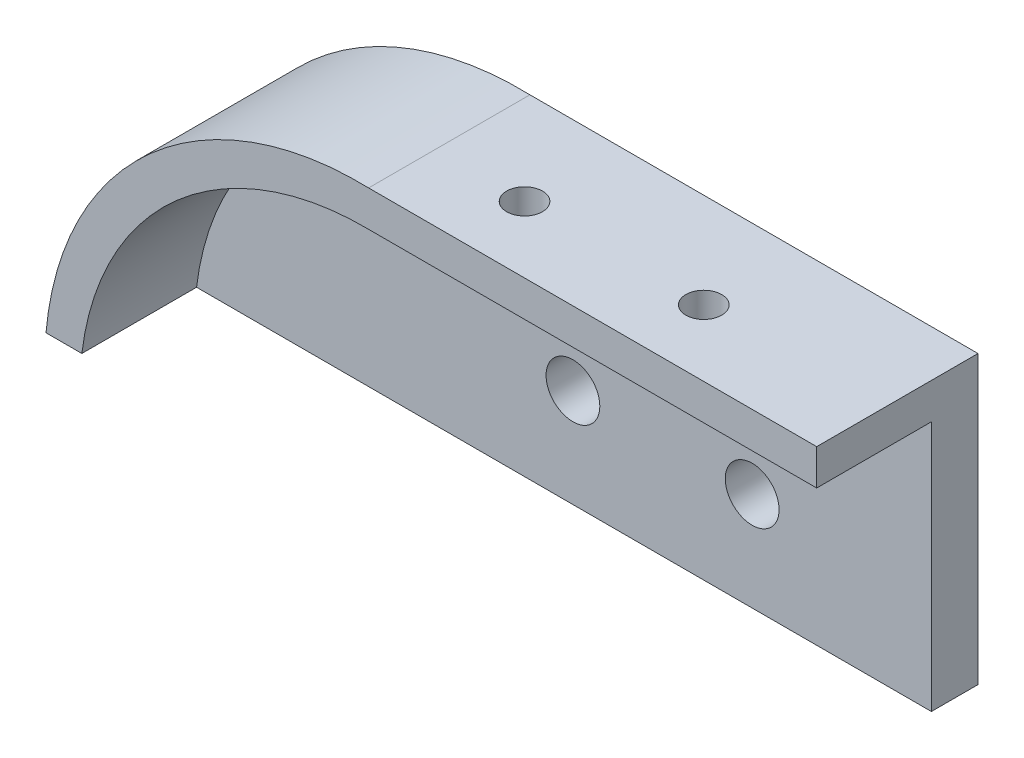
ISO-10303-21;
HEADER;
FILE_DESCRIPTION(('STEP AP214'),'2;1');
FILE_NAME('part.step','',(''),(''),'','','');
FILE_SCHEMA(('AUTOMOTIVE_DESIGN { 1 0 10303 214 1 1 1 1 }'));
ENDSEC;
DATA;
#1=APPLICATION_CONTEXT('core data for automotive mechanical design processes');
#2=APPLICATION_PROTOCOL_DEFINITION('international standard','automotive_design',2000,#1);
#3=PRODUCT_CONTEXT('',#1,'mechanical');
#4=PRODUCT('Part','Part','',(#3));
#5=PRODUCT_RELATED_PRODUCT_CATEGORY('part','',(#4));
#6=PRODUCT_DEFINITION_FORMATION('','',#4);
#7=PRODUCT_DEFINITION_CONTEXT('part definition',#1,'design');
#8=PRODUCT_DEFINITION('design','',#6,#7);
#9=PRODUCT_DEFINITION_SHAPE('','',#8);
#10=(LENGTH_UNIT() NAMED_UNIT(*) SI_UNIT(.MILLI.,.METRE.));
#11=(NAMED_UNIT(*) PLANE_ANGLE_UNIT() SI_UNIT($,.RADIAN.));
#12=(NAMED_UNIT(*) SI_UNIT($,.STERADIAN.) SOLID_ANGLE_UNIT());
#13=UNCERTAINTY_MEASURE_WITH_UNIT(LENGTH_MEASURE(1.E-05),#10,'distance_accuracy_value','');
#14=(GEOMETRIC_REPRESENTATION_CONTEXT(3) GLOBAL_UNCERTAINTY_ASSIGNED_CONTEXT((#13)) GLOBAL_UNIT_ASSIGNED_CONTEXT((#10,
#11,#12)) REPRESENTATION_CONTEXT('',''));
#15=CARTESIAN_POINT('',(0.,0.,0.));
#16=DIRECTION('',(0.,0.,1.));
#17=DIRECTION('',(1.,0.,0.));
#18=AXIS2_PLACEMENT_3D('',#15,#16,#17);
#19=CARTESIAN_POINT('',(-0.257118747397676,-0.773241409177615,0.));
#20=DIRECTION('',(0.,0.,1.));
#21=DIRECTION('',(1.,0.,0.));
#22=AXIS2_PLACEMENT_3D('',#19,#20,#21);
#23=CYLINDRICAL_SURFACE('',#22,8.7770083100093);
#24=CARTESIAN_POINT('',(-0.257118747397676,-0.773241409177615,4.5));
#25=DIRECTION('',(0.,0.,1.));
#26=DIRECTION('',(1.,0.,0.));
#27=AXIS2_PLACEMENT_3D('',#24,#25,#26);
#28=CIRCLE('',#27,8.7770083100093);
#29=CARTESIAN_POINT('',(0.,8.,4.5));
#30=VERTEX_POINT('',#29);
#31=CARTESIAN_POINT('',(-9.,0.,4.5));
#32=VERTEX_POINT('',#31);
#33=EDGE_CURVE('E139',#30,#32,#28,.T.);
#34=ORIENTED_EDGE('',*,*,#33,.F.);
#35=DIRECTION('',(0.,0.,1.));
#36=VECTOR('',#35,1.);
#37=CARTESIAN_POINT('',(0.,8.,0.));
#38=LINE('',#37,#36);
#39=CARTESIAN_POINT('',(0.,8.,0.));
#40=VERTEX_POINT('',#39);
#41=EDGE_CURVE('E11',#40,#30,#38,.T.);
#42=ORIENTED_EDGE('',*,*,#41,.F.);
#43=CARTESIAN_POINT('',(-0.257118747397676,-0.773241409177615,0.));
#44=DIRECTION('',(0.,0.,1.));
#45=DIRECTION('',(1.,0.,0.));
#46=AXIS2_PLACEMENT_3D('',#43,#44,#45);
#47=CIRCLE('',#46,8.7770083100093);
#48=CARTESIAN_POINT('',(-9.,0.,0.));
#49=VERTEX_POINT('',#48);
#50=EDGE_CURVE('E129',#40,#49,#47,.T.);
#51=ORIENTED_EDGE('',*,*,#50,.T.);
#52=DIRECTION('',(0.,0.,1.));
#53=VECTOR('',#52,1.);
#54=CARTESIAN_POINT('',(-9.,0.,0.));
#55=LINE('',#54,#53);
#56=EDGE_CURVE('E81',#49,#32,#55,.T.);
#57=ORIENTED_EDGE('',*,*,#56,.T.);
#58=EDGE_LOOP('',(#34,#42,#51,#57));
#59=FACE_BOUND('',#58,.T.);
#60=ADVANCED_FACE('F35',(#59),#23,.T.);
#61=CARTESIAN_POINT('',(12.5,8.,0.));
#62=DIRECTION('',(0.,1.,0.));
#63=DIRECTION('',(-1.,0.,0.));
#64=AXIS2_PLACEMENT_3D('',#61,#62,#63);
#65=PLANE('',#64);
#66=CARTESIAN_POINT('',(2.5,8.,2.65));
#67=DIRECTION('',(0.,1.,0.));
#68=DIRECTION('',(0.,0.,1.));
#69=AXIS2_PLACEMENT_3D('',#66,#67,#68);
#70=CIRCLE('',#69,0.499999999999988);
#71=CARTESIAN_POINT('',(2.5,8.,3.14999999999999));
#72=VERTEX_POINT('',#71);
#73=EDGE_CURVE('E163',#72,#72,#70,.T.);
#74=ORIENTED_EDGE('',*,*,#73,.F.);
#75=EDGE_LOOP('',(#74));
#76=FACE_BOUND('',#75,.T.);
#77=CARTESIAN_POINT('',(7.5,8.,2.65));
#78=DIRECTION('',(0.,1.,0.));
#79=DIRECTION('',(0.,0.,1.));
#80=AXIS2_PLACEMENT_3D('',#77,#78,#79);
#81=CIRCLE('',#80,0.499999999999988);
#82=CARTESIAN_POINT('',(7.5,8.,3.14999999999999));
#83=VERTEX_POINT('',#82);
#84=EDGE_CURVE('E154',#83,#83,#81,.T.);
#85=ORIENTED_EDGE('',*,*,#84,.F.);
#86=EDGE_LOOP('',(#85));
#87=FACE_BOUND('',#86,.T.);
#88=DIRECTION('',(-1.,0.,0.));
#89=VECTOR('',#88,1.);
#90=CARTESIAN_POINT('',(12.5,8.,4.5));
#91=LINE('',#90,#89);
#92=CARTESIAN_POINT('',(12.5,8.,4.5));
#93=VERTEX_POINT('',#92);
#94=EDGE_CURVE('E132',#93,#30,#91,.T.);
#95=ORIENTED_EDGE('',*,*,#94,.F.);
#96=DIRECTION('',(0.,0.,1.));
#97=VECTOR('',#96,1.);
#98=CARTESIAN_POINT('',(12.5,8.,0.));
#99=LINE('',#98,#97);
#100=CARTESIAN_POINT('',(12.5,8.,0.));
#101=VERTEX_POINT('',#100);
#102=EDGE_CURVE('E43',#101,#93,#99,.T.);
#103=ORIENTED_EDGE('',*,*,#102,.F.);
#104=DIRECTION('',(-1.,0.,0.));
#105=VECTOR('',#104,1.);
#106=CARTESIAN_POINT('',(12.5,8.,0.));
#107=LINE('',#106,#105);
#108=EDGE_CURVE('E137',#101,#40,#107,.T.);
#109=ORIENTED_EDGE('',*,*,#108,.T.);
#110=ORIENTED_EDGE('',*,*,#41,.T.);
#111=EDGE_LOOP('',(#95,#103,#109,#110));
#112=FACE_BOUND('',#111,.T.);
#113=ADVANCED_FACE('F178',(#76,#87,#112),#65,.T.);
#114=CARTESIAN_POINT('',(12.5,0.,0.));
#115=DIRECTION('',(1.,0.,0.));
#116=DIRECTION('',(0.,0.,-1.));
#117=AXIS2_PLACEMENT_3D('',#114,#115,#116);
#118=PLANE('',#117);
#119=DIRECTION('',(0.,0.,1.));
#120=VECTOR('',#119,1.);
#121=CARTESIAN_POINT('',(12.5,7.,1.3));
#122=LINE('',#121,#120);
#123=CARTESIAN_POINT('',(12.5,7.,1.3));
#124=VERTEX_POINT('',#123);
#125=CARTESIAN_POINT('',(12.5,7.,4.5));
#126=VERTEX_POINT('',#125);
#127=EDGE_CURVE('E51',#124,#126,#122,.T.);
#128=ORIENTED_EDGE('',*,*,#127,.F.);
#129=DIRECTION('',(0.,1.,0.));
#130=VECTOR('',#129,1.);
#131=CARTESIAN_POINT('',(12.5,0.,1.3));
#132=LINE('',#131,#130);
#133=CARTESIAN_POINT('',(12.5,0.,1.3));
#134=VERTEX_POINT('',#133);
#135=EDGE_CURVE('E109',#134,#124,#132,.T.);
#136=ORIENTED_EDGE('',*,*,#135,.F.);
#137=DIRECTION('',(0.,0.,1.));
#138=VECTOR('',#137,1.);
#139=CARTESIAN_POINT('',(12.5,0.,0.));
#140=LINE('',#139,#138);
#141=CARTESIAN_POINT('',(12.5,0.,0.));
#142=VERTEX_POINT('',#141);
#143=EDGE_CURVE('E149',#142,#134,#140,.T.);
#144=ORIENTED_EDGE('',*,*,#143,.F.);
#145=DIRECTION('',(0.,1.,0.));
#146=VECTOR('',#145,1.);
#147=CARTESIAN_POINT('',(12.5,0.,0.));
#148=LINE('',#147,#146);
#149=EDGE_CURVE('E134',#142,#101,#148,.T.);
#150=ORIENTED_EDGE('',*,*,#149,.T.);
#151=ORIENTED_EDGE('',*,*,#102,.T.);
#152=DIRECTION('',(0.,1.,0.));
#153=VECTOR('',#152,1.);
#154=CARTESIAN_POINT('',(12.5,0.,4.5));
#155=LINE('',#154,#153);
#156=EDGE_CURVE('E122',#126,#93,#155,.T.);
#157=ORIENTED_EDGE('',*,*,#156,.F.);
#158=EDGE_LOOP('',(#128,#136,#144,#150,#151,#157));
#159=FACE_BOUND('',#158,.T.);
#160=ADVANCED_FACE('F120',(#159),#118,.T.);
#161=CARTESIAN_POINT('',(-9.,0.,0.));
#162=DIRECTION('',(0.,-1.,0.));
#163=DIRECTION('',(0.,0.,-1.));
#164=AXIS2_PLACEMENT_3D('',#161,#162,#163);
#165=PLANE('',#164);
#166=DIRECTION('',(0.,0.,1.));
#167=VECTOR('',#166,1.);
#168=CARTESIAN_POINT('',(-8.,0.,1.3));
#169=LINE('',#168,#167);
#170=CARTESIAN_POINT('',(-8.,0.,1.3));
#171=VERTEX_POINT('',#170);
#172=CARTESIAN_POINT('',(-8.,0.,4.5));
#173=VERTEX_POINT('',#172);
#174=EDGE_CURVE('E124',#171,#173,#169,.T.);
#175=ORIENTED_EDGE('',*,*,#174,.T.);
#176=DIRECTION('',(1.,0.,0.));
#177=VECTOR('',#176,1.);
#178=CARTESIAN_POINT('',(-9.,0.,4.5));
#179=LINE('',#178,#177);
#180=EDGE_CURVE('E142',#32,#173,#179,.T.);
#181=ORIENTED_EDGE('',*,*,#180,.F.);
#182=ORIENTED_EDGE('',*,*,#56,.F.);
#183=DIRECTION('',(1.,0.,0.));
#184=VECTOR('',#183,1.);
#185=CARTESIAN_POINT('',(-9.,0.,0.));
#186=LINE('',#185,#184);
#187=EDGE_CURVE('E131',#49,#142,#186,.T.);
#188=ORIENTED_EDGE('',*,*,#187,.T.);
#189=ORIENTED_EDGE('',*,*,#143,.T.);
#190=DIRECTION('',(1.,0.,0.));
#191=VECTOR('',#190,1.);
#192=CARTESIAN_POINT('',(-8.,0.,1.3));
#193=LINE('',#192,#191);
#194=EDGE_CURVE('E114',#171,#134,#193,.T.);
#195=ORIENTED_EDGE('',*,*,#194,.F.);
#196=EDGE_LOOP('',(#175,#181,#182,#188,#189,#195));
#197=FACE_BOUND('',#196,.T.);
#198=ADVANCED_FACE('F169',(#197),#165,.T.);
#199=CARTESIAN_POINT('',(-0.257118747397676,-0.773241409177615,0.));
#200=DIRECTION('',(0.,0.,1.));
#201=DIRECTION('',(1.,0.,0.));
#202=AXIS2_PLACEMENT_3D('',#199,#200,#201);
#203=PLANE('',#202);
#204=CARTESIAN_POINT('',(7.5,2.75,0.));
#205=DIRECTION('',(0.,0.,1.));
#206=DIRECTION('',(1.,0.,0.));
#207=AXIS2_PLACEMENT_3D('',#204,#205,#206);
#208=CIRCLE('',#207,0.749999999999987);
#209=CARTESIAN_POINT('',(8.24999999999999,2.75,0.));
#210=VERTEX_POINT('',#209);
#211=EDGE_CURVE('E229',#210,#210,#208,.T.);
#212=ORIENTED_EDGE('',*,*,#211,.T.);
#213=EDGE_LOOP('',(#212));
#214=FACE_BOUND('',#213,.T.);
#215=CARTESIAN_POINT('',(2.5,2.75,0.));
#216=DIRECTION('',(0.,0.,1.));
#217=DIRECTION('',(1.,0.,0.));
#218=AXIS2_PLACEMENT_3D('',#215,#216,#217);
#219=CIRCLE('',#218,0.749999999999987);
#220=CARTESIAN_POINT('',(3.24999999999999,2.75,0.));
#221=VERTEX_POINT('',#220);
#222=EDGE_CURVE('E238',#221,#221,#219,.T.);
#223=ORIENTED_EDGE('',*,*,#222,.T.);
#224=EDGE_LOOP('',(#223));
#225=FACE_BOUND('',#224,.T.);
#226=ORIENTED_EDGE('',*,*,#50,.F.);
#227=ORIENTED_EDGE('',*,*,#108,.F.);
#228=ORIENTED_EDGE('',*,*,#149,.F.);
#229=ORIENTED_EDGE('',*,*,#187,.F.);
#230=EDGE_LOOP('',(#226,#227,#228,#229));
#231=FACE_BOUND('',#230,.T.);
#232=ADVANCED_FACE('F176',(#214,#225,#231),#203,.F.);
#233=CARTESIAN_POINT('',(-0.257118747397676,-0.773241409177615,4.5));
#234=DIRECTION('',(0.,0.,1.));
#235=DIRECTION('',(1.,0.,0.));
#236=AXIS2_PLACEMENT_3D('',#233,#234,#235);
#237=PLANE('',#236);
#238=CARTESIAN_POINT('',(-0.103321760120071,-0.953346559862777,4.5));
#239=DIRECTION('',(0.,0.,1.));
#240=DIRECTION('',(1.,0.,0.));
#241=AXIS2_PLACEMENT_3D('',#238,#239,#240);
#242=CIRCLE('',#241,7.95401765697031);
#243=CARTESIAN_POINT('',(0.,7.,4.5));
#244=VERTEX_POINT('',#243);
#245=EDGE_CURVE('E117',#244,#173,#242,.T.);
#246=ORIENTED_EDGE('',*,*,#245,.F.);
#247=DIRECTION('',(-1.,0.,0.));
#248=VECTOR('',#247,1.);
#249=CARTESIAN_POINT('',(12.5,7.,4.5));
#250=LINE('',#249,#248);
#251=EDGE_CURVE('E153',#126,#244,#250,.T.);
#252=ORIENTED_EDGE('',*,*,#251,.F.);
#253=ORIENTED_EDGE('',*,*,#156,.T.);
#254=ORIENTED_EDGE('',*,*,#94,.T.);
#255=ORIENTED_EDGE('',*,*,#33,.T.);
#256=ORIENTED_EDGE('',*,*,#180,.T.);
#257=EDGE_LOOP('',(#246,#252,#253,#254,#255,#256));
#258=FACE_BOUND('',#257,.T.);
#259=ADVANCED_FACE('F173',(#258),#237,.T.);
#260=CARTESIAN_POINT('',(-0.103321760120071,-0.953346559862777,1.3));
#261=DIRECTION('',(0.,0.,1.));
#262=DIRECTION('',(1.,0.,0.));
#263=AXIS2_PLACEMENT_3D('',#260,#261,#262);
#264=CYLINDRICAL_SURFACE('',#263,7.95401765697031);
#265=ORIENTED_EDGE('',*,*,#245,.T.);
#266=ORIENTED_EDGE('',*,*,#174,.F.);
#267=CARTESIAN_POINT('',(-0.103321760120071,-0.953346559862777,1.3));
#268=DIRECTION('',(0.,0.,1.));
#269=DIRECTION('',(1.,0.,0.));
#270=AXIS2_PLACEMENT_3D('',#267,#268,#269);
#271=CIRCLE('',#270,7.95401765697031);
#272=CARTESIAN_POINT('',(0.,7.,1.3));
#273=VERTEX_POINT('',#272);
#274=EDGE_CURVE('E108',#273,#171,#271,.T.);
#275=ORIENTED_EDGE('',*,*,#274,.F.);
#276=DIRECTION('',(0.,0.,1.));
#277=VECTOR('',#276,1.);
#278=CARTESIAN_POINT('',(0.,7.,1.3));
#279=LINE('',#278,#277);
#280=EDGE_CURVE('E104',#273,#244,#279,.T.);
#281=ORIENTED_EDGE('',*,*,#280,.T.);
#282=EDGE_LOOP('',(#265,#266,#275,#281));
#283=FACE_BOUND('',#282,.T.);
#284=ADVANCED_FACE('F199',(#283),#264,.F.);
#285=CARTESIAN_POINT('',(12.5,7.,1.3));
#286=DIRECTION('',(0.,1.,0.));
#287=DIRECTION('',(0.,0.,1.));
#288=AXIS2_PLACEMENT_3D('',#285,#286,#287);
#289=PLANE('',#288);
#290=CARTESIAN_POINT('',(2.5,7.,2.65));
#291=DIRECTION('',(0.,1.,0.));
#292=DIRECTION('',(0.,0.,1.));
#293=AXIS2_PLACEMENT_3D('',#290,#291,#292);
#294=CIRCLE('',#293,0.499999999999987);
#295=CARTESIAN_POINT('',(2.5,7.,3.14999999999999));
#296=VERTEX_POINT('',#295);
#297=EDGE_CURVE('E38',#296,#296,#294,.T.);
#298=ORIENTED_EDGE('',*,*,#297,.T.);
#299=EDGE_LOOP('',(#298));
#300=FACE_BOUND('',#299,.T.);
#301=CARTESIAN_POINT('',(7.5,7.,2.65));
#302=DIRECTION('',(0.,1.,0.));
#303=DIRECTION('',(0.,0.,1.));
#304=AXIS2_PLACEMENT_3D('',#301,#302,#303);
#305=CIRCLE('',#304,0.499999999999987);
#306=CARTESIAN_POINT('',(7.5,7.,3.14999999999999));
#307=VERTEX_POINT('',#306);
#308=EDGE_CURVE('E151',#307,#307,#305,.T.);
#309=ORIENTED_EDGE('',*,*,#308,.T.);
#310=EDGE_LOOP('',(#309));
#311=FACE_BOUND('',#310,.T.);
#312=ORIENTED_EDGE('',*,*,#251,.T.);
#313=ORIENTED_EDGE('',*,*,#280,.F.);
#314=DIRECTION('',(-1.,0.,0.));
#315=VECTOR('',#314,1.);
#316=CARTESIAN_POINT('',(12.5,7.,1.3));
#317=LINE('',#316,#315);
#318=EDGE_CURVE('E101',#124,#273,#317,.T.);
#319=ORIENTED_EDGE('',*,*,#318,.F.);
#320=ORIENTED_EDGE('',*,*,#127,.T.);
#321=EDGE_LOOP('',(#312,#313,#319,#320));
#322=FACE_BOUND('',#321,.T.);
#323=ADVANCED_FACE('F103',(#300,#311,#322),#289,.F.);
#324=CARTESIAN_POINT('',(-0.103321760120071,-0.953346559862777,1.3));
#325=DIRECTION('',(0.,0.,1.));
#326=DIRECTION('',(1.,0.,0.));
#327=AXIS2_PLACEMENT_3D('',#324,#325,#326);
#328=PLANE('',#327);
#329=CARTESIAN_POINT('',(7.5,2.75,1.3));
#330=DIRECTION('',(0.,0.,1.));
#331=DIRECTION('',(1.,0.,0.));
#332=AXIS2_PLACEMENT_3D('',#329,#330,#331);
#333=CIRCLE('',#332,0.749999999999987);
#334=CARTESIAN_POINT('',(8.24999999999999,2.75,1.3));
#335=VERTEX_POINT('',#334);
#336=EDGE_CURVE('E232',#335,#335,#333,.T.);
#337=ORIENTED_EDGE('',*,*,#336,.F.);
#338=EDGE_LOOP('',(#337));
#339=FACE_BOUND('',#338,.T.);
#340=CARTESIAN_POINT('',(2.5,2.75,1.3));
#341=DIRECTION('',(0.,0.,1.));
#342=DIRECTION('',(1.,0.,0.));
#343=AXIS2_PLACEMENT_3D('',#340,#341,#342);
#344=CIRCLE('',#343,0.749999999999987);
#345=CARTESIAN_POINT('',(3.24999999999999,2.75,1.3));
#346=VERTEX_POINT('',#345);
#347=EDGE_CURVE('E234',#346,#346,#344,.T.);
#348=ORIENTED_EDGE('',*,*,#347,.F.);
#349=EDGE_LOOP('',(#348));
#350=FACE_BOUND('',#349,.T.);
#351=ORIENTED_EDGE('',*,*,#135,.T.);
#352=ORIENTED_EDGE('',*,*,#318,.T.);
#353=ORIENTED_EDGE('',*,*,#274,.T.);
#354=ORIENTED_EDGE('',*,*,#194,.T.);
#355=EDGE_LOOP('',(#351,#352,#353,#354));
#356=FACE_BOUND('',#355,.T.);
#357=ADVANCED_FACE('F112',(#339,#350,#356),#328,.T.);
#358=CARTESIAN_POINT('',(7.5,8.,2.65));
#359=DIRECTION('',(0.,1.,0.));
#360=DIRECTION('',(0.,0.,1.));
#361=AXIS2_PLACEMENT_3D('',#358,#359,#360);
#362=CYLINDRICAL_SURFACE('',#361,0.499999999999987);
#363=ORIENTED_EDGE('',*,*,#84,.T.);
#364=EDGE_LOOP('',(#363));
#365=FACE_BOUND('',#364,.T.);
#366=ORIENTED_EDGE('',*,*,#308,.F.);
#367=EDGE_LOOP('',(#366));
#368=FACE_BOUND('',#367,.T.);
#369=ADVANCED_FACE('F210',(#365,#368),#362,.F.);
#370=CARTESIAN_POINT('',(2.5,8.,2.65));
#371=DIRECTION('',(0.,1.,0.));
#372=DIRECTION('',(0.,0.,1.));
#373=AXIS2_PLACEMENT_3D('',#370,#371,#372);
#374=CYLINDRICAL_SURFACE('',#373,0.499999999999987);
#375=ORIENTED_EDGE('',*,*,#73,.T.);
#376=EDGE_LOOP('',(#375));
#377=FACE_BOUND('',#376,.T.);
#378=ORIENTED_EDGE('',*,*,#297,.F.);
#379=EDGE_LOOP('',(#378));
#380=FACE_BOUND('',#379,.T.);
#381=ADVANCED_FACE('F214',(#377,#380),#374,.F.);
#382=CARTESIAN_POINT('',(2.5,2.75,1.3));
#383=DIRECTION('',(0.,0.,1.));
#384=DIRECTION('',(1.,0.,0.));
#385=AXIS2_PLACEMENT_3D('',#382,#383,#384);
#386=CYLINDRICAL_SURFACE('',#385,0.749999999999987);
#387=ORIENTED_EDGE('',*,*,#222,.F.);
#388=EDGE_LOOP('',(#387));
#389=FACE_BOUND('',#388,.T.);
#390=ORIENTED_EDGE('',*,*,#347,.T.);
#391=EDGE_LOOP('',(#390));
#392=FACE_BOUND('',#391,.T.);
#393=ADVANCED_FACE('F217',(#389,#392),#386,.F.);
#394=CARTESIAN_POINT('',(7.5,2.75,1.3));
#395=DIRECTION('',(0.,0.,1.));
#396=DIRECTION('',(1.,0.,0.));
#397=AXIS2_PLACEMENT_3D('',#394,#395,#396);
#398=CYLINDRICAL_SURFACE('',#397,0.749999999999987);
#399=ORIENTED_EDGE('',*,*,#211,.F.);
#400=EDGE_LOOP('',(#399));
#401=FACE_BOUND('',#400,.T.);
#402=ORIENTED_EDGE('',*,*,#336,.T.);
#403=EDGE_LOOP('',(#402));
#404=FACE_BOUND('',#403,.T.);
#405=ADVANCED_FACE('F221',(#401,#404),#398,.F.);
#406=CLOSED_SHELL('',(#60,#113,#160,#198,#232,#259,#284,#323,#357,#369,#381,#393,#405));
#407=MANIFOLD_SOLID_BREP('B2',#406);
#408=ADVANCED_BREP_SHAPE_REPRESENTATION('',(#18,#407),#14);
#409=SHAPE_DEFINITION_REPRESENTATION(#9,#408);
ENDSEC;
END-ISO-10303-21;
